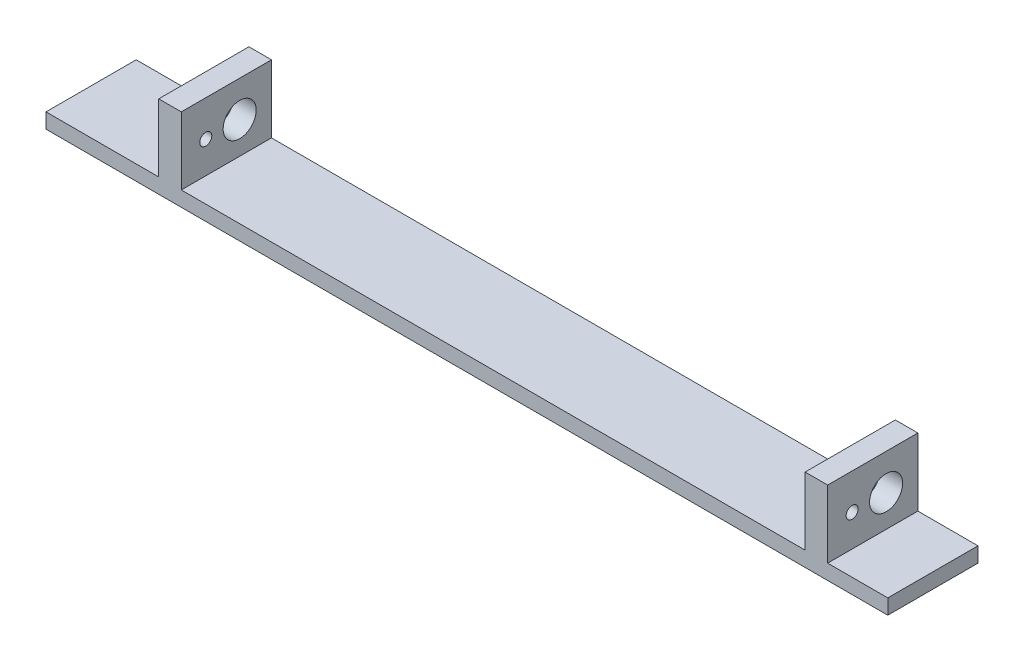
ISO-10303-21;
HEADER;
FILE_DESCRIPTION(('STEP AP214'),'2;1');
FILE_NAME('part.step','',(''),(''),'','','');
FILE_SCHEMA(('AUTOMOTIVE_DESIGN { 1 0 10303 214 1 1 1 1 }'));
ENDSEC;
DATA;
#1=APPLICATION_CONTEXT('core data for automotive mechanical design processes');
#2=APPLICATION_PROTOCOL_DEFINITION('international standard','automotive_design',2000,#1);
#3=PRODUCT_CONTEXT('',#1,'mechanical');
#4=PRODUCT('Part','Part','',(#3));
#5=PRODUCT_RELATED_PRODUCT_CATEGORY('part','',(#4));
#6=PRODUCT_DEFINITION_FORMATION('','',#4);
#7=PRODUCT_DEFINITION_CONTEXT('part definition',#1,'design');
#8=PRODUCT_DEFINITION('design','',#6,#7);
#9=PRODUCT_DEFINITION_SHAPE('','',#8);
#10=(LENGTH_UNIT() NAMED_UNIT(*) SI_UNIT(.MILLI.,.METRE.));
#11=(NAMED_UNIT(*) PLANE_ANGLE_UNIT() SI_UNIT($,.RADIAN.));
#12=(NAMED_UNIT(*) SI_UNIT($,.STERADIAN.) SOLID_ANGLE_UNIT());
#13=UNCERTAINTY_MEASURE_WITH_UNIT(LENGTH_MEASURE(1.E-05),#10,'distance_accuracy_value','');
#14=(GEOMETRIC_REPRESENTATION_CONTEXT(3) GLOBAL_UNCERTAINTY_ASSIGNED_CONTEXT((#13)) GLOBAL_UNIT_ASSIGNED_CONTEXT((#10,
#11,#12)) REPRESENTATION_CONTEXT('',''));
#15=CARTESIAN_POINT('',(0.,0.,0.));
#16=DIRECTION('',(0.,0.,1.));
#17=DIRECTION('',(1.,0.,0.));
#18=AXIS2_PLACEMENT_3D('',#15,#16,#17);
#19=CARTESIAN_POINT('',(560.,5.,30.));
#20=DIRECTION('',(0.,-1.,0.));
#21=DIRECTION('',(0.,0.,-1.));
#22=AXIS2_PLACEMENT_3D('',#19,#20,#21);
#23=PLANE('',#22);
#24=DIRECTION('',(0.,0.,1.));
#25=VECTOR('',#24,1.);
#26=CARTESIAN_POINT('',(505.,5.,30.));
#27=LINE('',#26,#25);
#28=CARTESIAN_POINT('',(505.,5.,-30.));
#29=VERTEX_POINT('',#28);
#30=CARTESIAN_POINT('',(505.,5.,30.));
#31=VERTEX_POINT('',#30);
#32=EDGE_CURVE('E229',#29,#31,#27,.T.);
#33=ORIENTED_EDGE('',*,*,#32,.F.);
#34=DIRECTION('',(-1.,0.,0.));
#35=VECTOR('',#34,1.);
#36=CARTESIAN_POINT('',(560.,5.,-30.));
#37=LINE('',#36,#35);
#38=CARTESIAN_POINT('',(90.,5.,-30.));
#39=VERTEX_POINT('',#38);
#40=EDGE_CURVE('E44',#29,#39,#37,.T.);
#41=ORIENTED_EDGE('',*,*,#40,.T.);
#42=DIRECTION('',(0.,0.,-1.));
#43=VECTOR('',#42,1.);
#44=CARTESIAN_POINT('',(90.,5.,-30.));
#45=LINE('',#44,#43);
#46=CARTESIAN_POINT('',(90.,5.,30.));
#47=VERTEX_POINT('',#46);
#48=EDGE_CURVE('E149',#47,#39,#45,.T.);
#49=ORIENTED_EDGE('',*,*,#48,.F.);
#50=DIRECTION('',(-1.,0.,0.));
#51=VECTOR('',#50,1.);
#52=CARTESIAN_POINT('',(560.,5.,30.));
#53=LINE('',#52,#51);
#54=EDGE_CURVE('E204',#31,#47,#53,.T.);
#55=ORIENTED_EDGE('',*,*,#54,.F.);
#56=EDGE_LOOP('',(#33,#41,#49,#55));
#57=FACE_BOUND('',#56,.T.);
#58=ADVANCED_FACE('F35',(#57),#23,.F.);
#59=DIRECTION('',(0.,0.,-1.));
#60=VECTOR('',#59,1.);
#61=CARTESIAN_POINT('',(520.,5.,-30.));
#62=LINE('',#61,#60);
#63=CARTESIAN_POINT('',(520.,5.,30.));
#64=VERTEX_POINT('',#63);
#65=CARTESIAN_POINT('',(520.,5.,-30.));
#66=VERTEX_POINT('',#65);
#67=EDGE_CURVE('E143',#64,#66,#62,.T.);
#68=ORIENTED_EDGE('',*,*,#67,.F.);
#69=CARTESIAN_POINT('',(560.,5.,30.));
#70=VERTEX_POINT('',#69);
#71=EDGE_CURVE('E202',#70,#64,#53,.T.);
#72=ORIENTED_EDGE('',*,*,#71,.F.);
#73=DIRECTION('',(0.,0.,1.));
#74=VECTOR('',#73,1.);
#75=CARTESIAN_POINT('',(560.,5.,30.));
#76=LINE('',#75,#74);
#77=CARTESIAN_POINT('',(560.,5.,-30.));
#78=VERTEX_POINT('',#77);
#79=EDGE_CURVE('E181',#78,#70,#76,.T.);
#80=ORIENTED_EDGE('',*,*,#79,.F.);
#81=EDGE_CURVE('E11',#78,#66,#37,.T.);
#82=ORIENTED_EDGE('',*,*,#81,.T.);
#83=EDGE_LOOP('',(#68,#72,#80,#82));
#84=FACE_BOUND('',#83,.T.);
#85=ADVANCED_FACE('F242',(#84),#23,.F.);
#86=DIRECTION('',(0.,0.,1.));
#87=VECTOR('',#86,1.);
#88=CARTESIAN_POINT('',(75.,5.,30.));
#89=LINE('',#88,#87);
#90=CARTESIAN_POINT('',(75.,5.,-30.));
#91=VERTEX_POINT('',#90);
#92=CARTESIAN_POINT('',(75.,5.,30.));
#93=VERTEX_POINT('',#92);
#94=EDGE_CURVE('E61',#91,#93,#89,.T.);
#95=ORIENTED_EDGE('',*,*,#94,.F.);
#96=CARTESIAN_POINT('',(0.,5.,-30.));
#97=VERTEX_POINT('',#96);
#98=EDGE_CURVE('E46',#91,#97,#37,.T.);
#99=ORIENTED_EDGE('',*,*,#98,.T.);
#100=DIRECTION('',(0.,0.,1.));
#101=VECTOR('',#100,1.);
#102=CARTESIAN_POINT('',(0.,5.,30.));
#103=LINE('',#102,#101);
#104=CARTESIAN_POINT('',(0.,5.,30.));
#105=VERTEX_POINT('',#104);
#106=EDGE_CURVE('E190',#97,#105,#103,.T.);
#107=ORIENTED_EDGE('',*,*,#106,.T.);
#108=EDGE_CURVE('E201',#93,#105,#53,.T.);
#109=ORIENTED_EDGE('',*,*,#108,.F.);
#110=EDGE_LOOP('',(#95,#99,#107,#109));
#111=FACE_BOUND('',#110,.T.);
#112=ADVANCED_FACE('F259',(#111),#23,.F.);
#113=CARTESIAN_POINT('',(560.,5.,-30.));
#114=DIRECTION('',(0.,0.,1.));
#115=DIRECTION('',(1.,0.,0.));
#116=AXIS2_PLACEMENT_3D('',#113,#114,#115);
#117=PLANE('',#116);
#118=DIRECTION('',(0.,1.,0.));
#119=VECTOR('',#118,1.);
#120=CARTESIAN_POINT('',(0.,5.,-30.));
#121=LINE('',#120,#119);
#122=CARTESIAN_POINT('',(0.,-5.,-30.));
#123=VERTEX_POINT('',#122);
#124=EDGE_CURVE('E177',#123,#97,#121,.T.);
#125=ORIENTED_EDGE('',*,*,#124,.T.);
#126=ORIENTED_EDGE('',*,*,#98,.F.);
#127=DIRECTION('',(0.,-1.,0.));
#128=VECTOR('',#127,1.);
#129=CARTESIAN_POINT('',(75.,50.,-30.));
#130=LINE('',#129,#128);
#131=CARTESIAN_POINT('',(75.,50.,-30.));
#132=VERTEX_POINT('',#131);
#133=EDGE_CURVE('E163',#132,#91,#130,.T.);
#134=ORIENTED_EDGE('',*,*,#133,.F.);
#135=DIRECTION('',(-1.,0.,0.));
#136=VECTOR('',#135,1.);
#137=CARTESIAN_POINT('',(75.,50.,-30.));
#138=LINE('',#137,#136);
#139=CARTESIAN_POINT('',(90.,50.,-30.));
#140=VERTEX_POINT('',#139);
#141=EDGE_CURVE('E162',#140,#132,#138,.T.);
#142=ORIENTED_EDGE('',*,*,#141,.F.);
#143=DIRECTION('',(0.,-1.,0.));
#144=VECTOR('',#143,1.);
#145=CARTESIAN_POINT('',(90.,50.,-30.));
#146=LINE('',#145,#144);
#147=EDGE_CURVE('E169',#140,#39,#146,.T.);
#148=ORIENTED_EDGE('',*,*,#147,.T.);
#149=ORIENTED_EDGE('',*,*,#40,.F.);
#150=DIRECTION('',(0.,-1.,0.));
#151=VECTOR('',#150,1.);
#152=CARTESIAN_POINT('',(505.,50.,-30.));
#153=LINE('',#152,#151);
#154=CARTESIAN_POINT('',(505.,50.,-30.));
#155=VERTEX_POINT('',#154);
#156=EDGE_CURVE('E130',#155,#29,#153,.T.);
#157=ORIENTED_EDGE('',*,*,#156,.F.);
#158=DIRECTION('',(-1.,0.,0.));
#159=VECTOR('',#158,1.);
#160=CARTESIAN_POINT('',(505.,50.,-30.));
#161=LINE('',#160,#159);
#162=CARTESIAN_POINT('',(520.,50.,-30.));
#163=VERTEX_POINT('',#162);
#164=EDGE_CURVE('E134',#163,#155,#161,.T.);
#165=ORIENTED_EDGE('',*,*,#164,.F.);
#166=DIRECTION('',(0.,-1.,0.));
#167=VECTOR('',#166,1.);
#168=CARTESIAN_POINT('',(520.,50.,-30.));
#169=LINE('',#168,#167);
#170=EDGE_CURVE('E233',#163,#66,#169,.T.);
#171=ORIENTED_EDGE('',*,*,#170,.T.);
#172=ORIENTED_EDGE('',*,*,#81,.F.);
#173=DIRECTION('',(0.,1.,0.));
#174=VECTOR('',#173,1.);
#175=CARTESIAN_POINT('',(560.,5.,-30.));
#176=LINE('',#175,#174);
#177=CARTESIAN_POINT('',(560.,-5.,-30.));
#178=VERTEX_POINT('',#177);
#179=EDGE_CURVE('E178',#178,#78,#176,.T.);
#180=ORIENTED_EDGE('',*,*,#179,.F.);
#181=DIRECTION('',(-1.,0.,0.));
#182=VECTOR('',#181,1.);
#183=CARTESIAN_POINT('',(560.,-5.,-30.));
#184=LINE('',#183,#182);
#185=EDGE_CURVE('E188',#178,#123,#184,.T.);
#186=ORIENTED_EDGE('',*,*,#185,.T.);
#187=EDGE_LOOP('',(#125,#126,#134,#142,#148,#149,#157,#165,#171,#172,#180,#186));
#188=FACE_BOUND('',#187,.T.);
#189=ADVANCED_FACE('F37',(#188),#117,.F.);
#190=CARTESIAN_POINT('',(560.,5.,30.));
#191=DIRECTION('',(0.,0.,-1.));
#192=DIRECTION('',(-1.,0.,0.));
#193=AXIS2_PLACEMENT_3D('',#190,#191,#192);
#194=PLANE('',#193);
#195=DIRECTION('',(0.,-1.,0.));
#196=VECTOR('',#195,1.);
#197=CARTESIAN_POINT('',(0.,5.,30.));
#198=LINE('',#197,#196);
#199=CARTESIAN_POINT('',(0.,-5.,30.));
#200=VERTEX_POINT('',#199);
#201=EDGE_CURVE('E193',#105,#200,#198,.T.);
#202=ORIENTED_EDGE('',*,*,#201,.T.);
#203=DIRECTION('',(-1.,0.,0.));
#204=VECTOR('',#203,1.);
#205=CARTESIAN_POINT('',(560.,-5.,30.));
#206=LINE('',#205,#204);
#207=CARTESIAN_POINT('',(560.,-5.,30.));
#208=VERTEX_POINT('',#207);
#209=EDGE_CURVE('E198',#208,#200,#206,.T.);
#210=ORIENTED_EDGE('',*,*,#209,.F.);
#211=DIRECTION('',(0.,-1.,0.));
#212=VECTOR('',#211,1.);
#213=CARTESIAN_POINT('',(560.,5.,30.));
#214=LINE('',#213,#212);
#215=EDGE_CURVE('E184',#70,#208,#214,.T.);
#216=ORIENTED_EDGE('',*,*,#215,.F.);
#217=ORIENTED_EDGE('',*,*,#71,.T.);
#218=DIRECTION('',(0.,-1.,0.));
#219=VECTOR('',#218,1.);
#220=CARTESIAN_POINT('',(520.,50.,30.));
#221=LINE('',#220,#219);
#222=CARTESIAN_POINT('',(520.,50.,30.));
#223=VERTEX_POINT('',#222);
#224=EDGE_CURVE('E151',#223,#64,#221,.T.);
#225=ORIENTED_EDGE('',*,*,#224,.F.);
#226=DIRECTION('',(1.,0.,0.));
#227=VECTOR('',#226,1.);
#228=CARTESIAN_POINT('',(520.,50.,30.));
#229=LINE('',#228,#227);
#230=CARTESIAN_POINT('',(505.,50.,30.));
#231=VERTEX_POINT('',#230);
#232=EDGE_CURVE('E133',#231,#223,#229,.T.);
#233=ORIENTED_EDGE('',*,*,#232,.F.);
#234=DIRECTION('',(0.,-1.,0.));
#235=VECTOR('',#234,1.);
#236=CARTESIAN_POINT('',(505.,50.,30.));
#237=LINE('',#236,#235);
#238=EDGE_CURVE('E53',#231,#31,#237,.T.);
#239=ORIENTED_EDGE('',*,*,#238,.T.);
#240=ORIENTED_EDGE('',*,*,#54,.T.);
#241=DIRECTION('',(0.,-1.,0.));
#242=VECTOR('',#241,1.);
#243=CARTESIAN_POINT('',(90.,50.,30.));
#244=LINE('',#243,#242);
#245=CARTESIAN_POINT('',(90.,50.,30.));
#246=VERTEX_POINT('',#245);
#247=EDGE_CURVE('E171',#246,#47,#244,.T.);
#248=ORIENTED_EDGE('',*,*,#247,.F.);
#249=DIRECTION('',(1.,0.,0.));
#250=VECTOR('',#249,1.);
#251=CARTESIAN_POINT('',(90.,50.,30.));
#252=LINE('',#251,#250);
#253=CARTESIAN_POINT('',(75.,50.,30.));
#254=VERTEX_POINT('',#253);
#255=EDGE_CURVE('E158',#254,#246,#252,.T.);
#256=ORIENTED_EDGE('',*,*,#255,.F.);
#257=DIRECTION('',(0.,-1.,0.));
#258=VECTOR('',#257,1.);
#259=CARTESIAN_POINT('',(75.,50.,30.));
#260=LINE('',#259,#258);
#261=EDGE_CURVE('E174',#254,#93,#260,.T.);
#262=ORIENTED_EDGE('',*,*,#261,.T.);
#263=ORIENTED_EDGE('',*,*,#108,.T.);
#264=EDGE_LOOP('',(#202,#210,#216,#217,#225,#233,#239,#240,#248,#256,#262,#263));
#265=FACE_BOUND('',#264,.T.);
#266=ADVANCED_FACE('F245',(#265),#194,.F.);
#267=CARTESIAN_POINT('',(560.,-5.,30.));
#268=DIRECTION('',(0.,1.,0.));
#269=DIRECTION('',(0.,0.,1.));
#270=AXIS2_PLACEMENT_3D('',#267,#268,#269);
#271=PLANE('',#270);
#272=DIRECTION('',(0.,0.,-1.));
#273=VECTOR('',#272,1.);
#274=CARTESIAN_POINT('',(0.,-5.,30.));
#275=LINE('',#274,#273);
#276=EDGE_CURVE('E182',#200,#123,#275,.T.);
#277=ORIENTED_EDGE('',*,*,#276,.T.);
#278=ORIENTED_EDGE('',*,*,#185,.F.);
#279=DIRECTION('',(0.,0.,-1.));
#280=VECTOR('',#279,1.);
#281=CARTESIAN_POINT('',(560.,-5.,30.));
#282=LINE('',#281,#280);
#283=EDGE_CURVE('E186',#208,#178,#282,.T.);
#284=ORIENTED_EDGE('',*,*,#283,.F.);
#285=ORIENTED_EDGE('',*,*,#209,.T.);
#286=EDGE_LOOP('',(#277,#278,#284,#285));
#287=FACE_BOUND('',#286,.T.);
#288=ADVANCED_FACE('F300',(#287),#271,.F.);
#289=CARTESIAN_POINT('',(560.,0.,0.));
#290=DIRECTION('',(1.,0.,0.));
#291=DIRECTION('',(0.,0.,-1.));
#292=AXIS2_PLACEMENT_3D('',#289,#290,#291);
#293=PLANE('',#292);
#294=ORIENTED_EDGE('',*,*,#179,.T.);
#295=ORIENTED_EDGE('',*,*,#79,.T.);
#296=ORIENTED_EDGE('',*,*,#215,.T.);
#297=ORIENTED_EDGE('',*,*,#283,.T.);
#298=EDGE_LOOP('',(#294,#295,#296,#297));
#299=FACE_BOUND('',#298,.T.);
#300=ADVANCED_FACE('F249',(#299),#293,.T.);
#301=CARTESIAN_POINT('',(0.,0.,0.));
#302=DIRECTION('',(1.,0.,0.));
#303=DIRECTION('',(0.,0.,-1.));
#304=AXIS2_PLACEMENT_3D('',#301,#302,#303);
#305=PLANE('',#304);
#306=ORIENTED_EDGE('',*,*,#124,.F.);
#307=ORIENTED_EDGE('',*,*,#276,.F.);
#308=ORIENTED_EDGE('',*,*,#201,.F.);
#309=ORIENTED_EDGE('',*,*,#106,.F.);
#310=EDGE_LOOP('',(#306,#307,#308,#309));
#311=FACE_BOUND('',#310,.T.);
#312=ADVANCED_FACE('F257',(#311),#305,.F.);
#313=CARTESIAN_POINT('',(75.,50.,30.));
#314=DIRECTION('',(1.,0.,0.));
#315=DIRECTION('',(0.,0.,-1.));
#316=AXIS2_PLACEMENT_3D('',#313,#314,#315);
#317=PLANE('',#316);
#318=CARTESIAN_POINT('',(75.,26.15,-8.85000000000001));
#319=DIRECTION('',(-1.,0.,0.));
#320=DIRECTION('',(0.,0.,1.));
#321=AXIS2_PLACEMENT_3D('',#318,#319,#320);
#322=CIRCLE('',#321,11.);
#323=CARTESIAN_POINT('',(75.,26.15,2.14999999999999));
#324=VERTEX_POINT('',#323);
#325=EDGE_CURVE('E208',#324,#324,#322,.T.);
#326=ORIENTED_EDGE('',*,*,#325,.F.);
#327=EDGE_LOOP('',(#326));
#328=FACE_BOUND('',#327,.T.);
#329=CARTESIAN_POINT('',(75.,26.15,13.717950956118));
#330=DIRECTION('',(-1.,0.,0.));
#331=DIRECTION('',(0.,0.,1.));
#332=AXIS2_PLACEMENT_3D('',#329,#330,#331);
#333=CIRCLE('',#332,4.);
#334=CARTESIAN_POINT('',(75.,26.15,17.717950956118));
#335=VERTEX_POINT('',#334);
#336=EDGE_CURVE('E215',#335,#335,#333,.T.);
#337=ORIENTED_EDGE('',*,*,#336,.F.);
#338=EDGE_LOOP('',(#337));
#339=FACE_BOUND('',#338,.T.);
#340=ORIENTED_EDGE('',*,*,#94,.T.);
#341=ORIENTED_EDGE('',*,*,#261,.F.);
#342=DIRECTION('',(0.,0.,1.));
#343=VECTOR('',#342,1.);
#344=CARTESIAN_POINT('',(75.,50.,30.));
#345=LINE('',#344,#343);
#346=EDGE_CURVE('E155',#132,#254,#345,.T.);
#347=ORIENTED_EDGE('',*,*,#346,.F.);
#348=ORIENTED_EDGE('',*,*,#133,.T.);
#349=EDGE_LOOP('',(#340,#341,#347,#348));
#350=FACE_BOUND('',#349,.T.);
#351=ADVANCED_FACE('F275',(#328,#339,#350),#317,.F.);
#352=CARTESIAN_POINT('',(90.,50.,-30.));
#353=DIRECTION('',(-1.,0.,0.));
#354=DIRECTION('',(0.,0.,1.));
#355=AXIS2_PLACEMENT_3D('',#352,#353,#354);
#356=PLANE('',#355);
#357=CARTESIAN_POINT('',(90.,26.15,-8.85000000000001));
#358=DIRECTION('',(-1.,0.,0.));
#359=DIRECTION('',(0.,0.,1.));
#360=AXIS2_PLACEMENT_3D('',#357,#358,#359);
#361=CIRCLE('',#360,11.);
#362=CARTESIAN_POINT('',(90.,26.15,2.14999999999999));
#363=VERTEX_POINT('',#362);
#364=EDGE_CURVE('E227',#363,#363,#361,.T.);
#365=ORIENTED_EDGE('',*,*,#364,.T.);
#366=EDGE_LOOP('',(#365));
#367=FACE_BOUND('',#366,.T.);
#368=CARTESIAN_POINT('',(90.,26.15,13.717950956118));
#369=DIRECTION('',(-1.,0.,0.));
#370=DIRECTION('',(0.,0.,1.));
#371=AXIS2_PLACEMENT_3D('',#368,#369,#370);
#372=CIRCLE('',#371,4.);
#373=CARTESIAN_POINT('',(90.,26.15,17.717950956118));
#374=VERTEX_POINT('',#373);
#375=EDGE_CURVE('E212',#374,#374,#372,.T.);
#376=ORIENTED_EDGE('',*,*,#375,.T.);
#377=EDGE_LOOP('',(#376));
#378=FACE_BOUND('',#377,.T.);
#379=ORIENTED_EDGE('',*,*,#48,.T.);
#380=ORIENTED_EDGE('',*,*,#147,.F.);
#381=DIRECTION('',(0.,0.,-1.));
#382=VECTOR('',#381,1.);
#383=CARTESIAN_POINT('',(90.,50.,-30.));
#384=LINE('',#383,#382);
#385=EDGE_CURVE('E160',#246,#140,#384,.T.);
#386=ORIENTED_EDGE('',*,*,#385,.F.);
#387=ORIENTED_EDGE('',*,*,#247,.T.);
#388=EDGE_LOOP('',(#379,#380,#386,#387));
#389=FACE_BOUND('',#388,.T.);
#390=ADVANCED_FACE('F266',(#367,#378,#389),#356,.F.);
#391=CARTESIAN_POINT('',(0.,50.,0.));
#392=DIRECTION('',(0.,-1.,0.));
#393=DIRECTION('',(0.,0.,-1.));
#394=AXIS2_PLACEMENT_3D('',#391,#392,#393);
#395=PLANE('',#394);
#396=ORIENTED_EDGE('',*,*,#346,.T.);
#397=ORIENTED_EDGE('',*,*,#255,.T.);
#398=ORIENTED_EDGE('',*,*,#385,.T.);
#399=ORIENTED_EDGE('',*,*,#141,.T.);
#400=EDGE_LOOP('',(#396,#397,#398,#399));
#401=FACE_BOUND('',#400,.T.);
#402=ADVANCED_FACE('F272',(#401),#395,.F.);
#403=CARTESIAN_POINT('',(505.,50.,30.));
#404=DIRECTION('',(1.,0.,0.));
#405=DIRECTION('',(0.,0.,-1.));
#406=AXIS2_PLACEMENT_3D('',#403,#404,#405);
#407=PLANE('',#406);
#408=CARTESIAN_POINT('',(505.,26.15,-8.85000000000001));
#409=DIRECTION('',(1.,0.,0.));
#410=DIRECTION('',(0.,0.,-1.));
#411=AXIS2_PLACEMENT_3D('',#408,#409,#410);
#412=CIRCLE('',#411,11.);
#413=CARTESIAN_POINT('',(505.,26.15,2.14999999999999));
#414=VERTEX_POINT('',#413);
#415=EDGE_CURVE('E224',#414,#414,#412,.T.);
#416=ORIENTED_EDGE('',*,*,#415,.T.);
#417=EDGE_LOOP('',(#416));
#418=FACE_BOUND('',#417,.T.);
#419=CARTESIAN_POINT('',(505.,26.15,13.717950956118));
#420=DIRECTION('',(1.,0.,0.));
#421=DIRECTION('',(0.,0.,-1.));
#422=AXIS2_PLACEMENT_3D('',#419,#420,#421);
#423=CIRCLE('',#422,4.);
#424=CARTESIAN_POINT('',(505.,26.15,17.717950956118));
#425=VERTEX_POINT('',#424);
#426=EDGE_CURVE('E207',#425,#425,#423,.T.);
#427=ORIENTED_EDGE('',*,*,#426,.T.);
#428=EDGE_LOOP('',(#427));
#429=FACE_BOUND('',#428,.T.);
#430=ORIENTED_EDGE('',*,*,#32,.T.);
#431=ORIENTED_EDGE('',*,*,#238,.F.);
#432=DIRECTION('',(0.,0.,1.));
#433=VECTOR('',#432,1.);
#434=CARTESIAN_POINT('',(505.,50.,30.));
#435=LINE('',#434,#433);
#436=EDGE_CURVE('E126',#155,#231,#435,.T.);
#437=ORIENTED_EDGE('',*,*,#436,.F.);
#438=ORIENTED_EDGE('',*,*,#156,.T.);
#439=EDGE_LOOP('',(#430,#431,#437,#438));
#440=FACE_BOUND('',#439,.T.);
#441=ADVANCED_FACE('F128',(#418,#429,#440),#407,.F.);
#442=CARTESIAN_POINT('',(520.,50.,-30.));
#443=DIRECTION('',(-1.,0.,0.));
#444=DIRECTION('',(0.,0.,1.));
#445=AXIS2_PLACEMENT_3D('',#442,#443,#444);
#446=PLANE('',#445);
#447=CARTESIAN_POINT('',(520.,26.15,-8.85000000000001));
#448=DIRECTION('',(-1.,0.,0.));
#449=DIRECTION('',(0.,0.,1.));
#450=AXIS2_PLACEMENT_3D('',#447,#448,#449);
#451=CIRCLE('',#450,11.);
#452=CARTESIAN_POINT('',(520.,26.15,2.14999999999999));
#453=VERTEX_POINT('',#452);
#454=EDGE_CURVE('E39',#453,#453,#451,.T.);
#455=ORIENTED_EDGE('',*,*,#454,.T.);
#456=EDGE_LOOP('',(#455));
#457=FACE_BOUND('',#456,.T.);
#458=CARTESIAN_POINT('',(520.,26.15,13.717950956118));
#459=DIRECTION('',(-1.,0.,0.));
#460=DIRECTION('',(0.,0.,1.));
#461=AXIS2_PLACEMENT_3D('',#458,#459,#460);
#462=CIRCLE('',#461,4.);
#463=CARTESIAN_POINT('',(520.,26.15,17.717950956118));
#464=VERTEX_POINT('',#463);
#465=EDGE_CURVE('E205',#464,#464,#462,.T.);
#466=ORIENTED_EDGE('',*,*,#465,.T.);
#467=EDGE_LOOP('',(#466));
#468=FACE_BOUND('',#467,.T.);
#469=ORIENTED_EDGE('',*,*,#67,.T.);
#470=ORIENTED_EDGE('',*,*,#170,.F.);
#471=DIRECTION('',(0.,0.,-1.));
#472=VECTOR('',#471,1.);
#473=CARTESIAN_POINT('',(520.,50.,-30.));
#474=LINE('',#473,#472);
#475=EDGE_CURVE('E139',#223,#163,#474,.T.);
#476=ORIENTED_EDGE('',*,*,#475,.F.);
#477=ORIENTED_EDGE('',*,*,#224,.T.);
#478=EDGE_LOOP('',(#469,#470,#476,#477));
#479=FACE_BOUND('',#478,.T.);
#480=ADVANCED_FACE('F239',(#457,#468,#479),#446,.F.);
#481=CARTESIAN_POINT('',(0.,50.,0.));
#482=DIRECTION('',(0.,-1.,0.));
#483=DIRECTION('',(0.,0.,-1.));
#484=AXIS2_PLACEMENT_3D('',#481,#482,#483);
#485=PLANE('',#484);
#486=ORIENTED_EDGE('',*,*,#164,.T.);
#487=ORIENTED_EDGE('',*,*,#436,.T.);
#488=ORIENTED_EDGE('',*,*,#232,.T.);
#489=ORIENTED_EDGE('',*,*,#475,.T.);
#490=EDGE_LOOP('',(#486,#487,#488,#489));
#491=FACE_BOUND('',#490,.T.);
#492=ADVANCED_FACE('F137',(#491),#485,.F.);
#493=CARTESIAN_POINT('',(530.,26.15,13.717950956118));
#494=DIRECTION('',(-1.,0.,0.));
#495=DIRECTION('',(0.,0.,1.));
#496=AXIS2_PLACEMENT_3D('',#493,#494,#495);
#497=CYLINDRICAL_SURFACE('',#496,4.);
#498=CARTESIAN_POINT('',(520.,26.15,17.717950956118));
#499=CARTESIAN_POINT('',(519.84375,26.15,17.717950956118));
#500=CARTESIAN_POINT('',(519.6875,26.15,17.717950956118));
#501=CARTESIAN_POINT('',(519.375,26.15,17.717950956118));
#502=CARTESIAN_POINT('',(519.21875,26.15,17.717950956118));
#503=CARTESIAN_POINT('',(518.90625,26.15,17.717950956118));
#504=CARTESIAN_POINT('',(518.75,26.15,17.717950956118));
#505=CARTESIAN_POINT('',(518.4375,26.15,17.717950956118));
#506=CARTESIAN_POINT('',(518.28125,26.15,17.717950956118));
#507=CARTESIAN_POINT('',(517.96875,26.15,17.717950956118));
#508=CARTESIAN_POINT('',(517.8125,26.15,17.717950956118));
#509=CARTESIAN_POINT('',(517.5,26.15,17.717950956118));
#510=CARTESIAN_POINT('',(517.34375,26.15,17.717950956118));
#511=CARTESIAN_POINT('',(517.03125,26.15,17.717950956118));
#512=CARTESIAN_POINT('',(516.875,26.15,17.717950956118));
#513=CARTESIAN_POINT('',(516.5625,26.15,17.717950956118));
#514=CARTESIAN_POINT('',(516.40625,26.15,17.717950956118));
#515=CARTESIAN_POINT('',(516.09375,26.15,17.717950956118));
#516=CARTESIAN_POINT('',(515.9375,26.15,17.717950956118));
#517=CARTESIAN_POINT('',(515.625,26.15,17.717950956118));
#518=CARTESIAN_POINT('',(515.46875,26.15,17.717950956118));
#519=CARTESIAN_POINT('',(515.15625,26.15,17.717950956118));
#520=CARTESIAN_POINT('',(515.,26.15,17.717950956118));
#521=CARTESIAN_POINT('',(514.6875,26.15,17.717950956118));
#522=CARTESIAN_POINT('',(514.53125,26.15,17.717950956118));
#523=CARTESIAN_POINT('',(514.21875,26.15,17.717950956118));
#524=CARTESIAN_POINT('',(514.0625,26.15,17.717950956118));
#525=CARTESIAN_POINT('',(513.75,26.15,17.717950956118));
#526=CARTESIAN_POINT('',(513.59375,26.15,17.717950956118));
#527=CARTESIAN_POINT('',(513.28125,26.15,17.717950956118));
#528=CARTESIAN_POINT('',(513.125,26.15,17.717950956118));
#529=CARTESIAN_POINT('',(512.8125,26.15,17.717950956118));
#530=CARTESIAN_POINT('',(512.65625,26.15,17.717950956118));
#531=CARTESIAN_POINT('',(512.34375,26.15,17.717950956118));
#532=CARTESIAN_POINT('',(512.1875,26.15,17.717950956118));
#533=CARTESIAN_POINT('',(511.875,26.15,17.717950956118));
#534=CARTESIAN_POINT('',(511.71875,26.15,17.717950956118));
#535=CARTESIAN_POINT('',(511.40625,26.15,17.717950956118));
#536=CARTESIAN_POINT('',(511.25,26.15,17.717950956118));
#537=CARTESIAN_POINT('',(510.9375,26.15,17.717950956118));
#538=CARTESIAN_POINT('',(510.78125,26.15,17.717950956118));
#539=CARTESIAN_POINT('',(510.46875,26.15,17.717950956118));
#540=CARTESIAN_POINT('',(510.3125,26.15,17.717950956118));
#541=CARTESIAN_POINT('',(510.,26.15,17.717950956118));
#542=CARTESIAN_POINT('',(509.84375,26.15,17.717950956118));
#543=CARTESIAN_POINT('',(509.53125,26.15,17.717950956118));
#544=CARTESIAN_POINT('',(509.375,26.15,17.717950956118));
#545=CARTESIAN_POINT('',(509.0625,26.15,17.717950956118));
#546=CARTESIAN_POINT('',(508.90625,26.15,17.717950956118));
#547=CARTESIAN_POINT('',(508.59375,26.15,17.717950956118));
#548=CARTESIAN_POINT('',(508.4375,26.15,17.717950956118));
#549=CARTESIAN_POINT('',(508.125,26.15,17.717950956118));
#550=CARTESIAN_POINT('',(507.96875,26.15,17.717950956118));
#551=CARTESIAN_POINT('',(507.65625,26.15,17.717950956118));
#552=CARTESIAN_POINT('',(507.5,26.15,17.717950956118));
#553=CARTESIAN_POINT('',(507.1875,26.15,17.717950956118));
#554=CARTESIAN_POINT('',(507.03125,26.15,17.717950956118));
#555=CARTESIAN_POINT('',(506.71875,26.15,17.717950956118));
#556=CARTESIAN_POINT('',(506.5625,26.15,17.717950956118));
#557=CARTESIAN_POINT('',(506.25,26.15,17.717950956118));
#558=CARTESIAN_POINT('',(506.09375,26.15,17.717950956118));
#559=CARTESIAN_POINT('',(505.78125,26.15,17.717950956118));
#560=CARTESIAN_POINT('',(505.625,26.15,17.717950956118));
#561=CARTESIAN_POINT('',(505.3125,26.15,17.717950956118));
#562=CARTESIAN_POINT('',(505.15625,26.15,17.717950956118));
#563=CARTESIAN_POINT('',(505.,26.15,17.717950956118));
#564=B_SPLINE_CURVE_WITH_KNOTS('',3,(#498,#499,#500,#501,#502,#503,#504,#505,#506,#507,#508,
#509,#510,#511,#512,#513,#514,#515,#516,#517,#518,#519,#520,#521,#522,#523,#524,#525,#526,#527,
#528,#529,#530,#531,#532,#533,#534,#535,#536,#537,#538,#539,#540,#541,#542,#543,#544,#545,#546,
#547,#548,#549,#550,#551,#552,#553,#554,#555,#556,#557,#558,#559,#560,#561,#562,#563),
.UNSPECIFIED.,.F.,.F.,(4,2,2,2,2,2,2,2,2,2,2,2,2,2,2,2,2,2,2,2,2,2,2,2,2,2,2,2,2,2,2,2,4),(0.,
0.468749999999907,0.937499999999925,1.40624999999994,1.87499999999996,2.34374999999998,2.8125,
3.28125000000001,3.74999999999992,4.21874999999994,4.68749999999996,5.15624999999997,
5.62499999999999,6.09375000000001,6.56250000000003,7.03125000000004,7.50000000000006,
7.96874999999997,8.43749999999999,8.90625,9.37500000000002,9.84375000000004,10.3125000000001,
10.7812500000001,11.25,11.71875,12.1875,12.65625,13.1250000000001,13.5937500000001,
14.0625000000001,14.5312500000001,15.0000000000001),.UNSPECIFIED.);
#565=EDGE_CURVE('BSEAM362',#464,#425,#564,.T.);
#566=ORIENTED_EDGE('',*,*,#465,.F.);
#567=ORIENTED_EDGE('',*,*,#426,.F.);
#568=ORIENTED_EDGE('',*,*,#565,.T.);
#569=ORIENTED_EDGE('',*,*,#565,.F.);
#570=EDGE_LOOP('',(#566,#568,#567,#569));
#571=FACE_BOUND('',#570,.T.);
#572=ADVANCED_FACE('F362',(#571),#497,.F.);
#573=CARTESIAN_POINT('',(530.,26.15,-8.85000000000001));
#574=DIRECTION('',(-1.,0.,0.));
#575=DIRECTION('',(0.,0.,1.));
#576=AXIS2_PLACEMENT_3D('',#573,#574,#575);
#577=CYLINDRICAL_SURFACE('',#576,11.);
#578=CARTESIAN_POINT('',(520.,26.15,2.14999999999999));
#579=CARTESIAN_POINT('',(519.84375,26.15,2.14999999999999));
#580=CARTESIAN_POINT('',(519.6875,26.15,2.14999999999999));
#581=CARTESIAN_POINT('',(519.375,26.15,2.14999999999999));
#582=CARTESIAN_POINT('',(519.21875,26.15,2.14999999999999));
#583=CARTESIAN_POINT('',(518.90625,26.15,2.14999999999999));
#584=CARTESIAN_POINT('',(518.75,26.15,2.14999999999999));
#585=CARTESIAN_POINT('',(518.4375,26.15,2.14999999999999));
#586=CARTESIAN_POINT('',(518.28125,26.15,2.14999999999999));
#587=CARTESIAN_POINT('',(517.96875,26.15,2.14999999999999));
#588=CARTESIAN_POINT('',(517.8125,26.15,2.14999999999999));
#589=CARTESIAN_POINT('',(517.5,26.15,2.14999999999999));
#590=CARTESIAN_POINT('',(517.34375,26.15,2.14999999999999));
#591=CARTESIAN_POINT('',(517.03125,26.15,2.14999999999999));
#592=CARTESIAN_POINT('',(516.875,26.15,2.14999999999999));
#593=CARTESIAN_POINT('',(516.5625,26.15,2.14999999999999));
#594=CARTESIAN_POINT('',(516.40625,26.15,2.14999999999999));
#595=CARTESIAN_POINT('',(516.09375,26.15,2.14999999999999));
#596=CARTESIAN_POINT('',(515.9375,26.15,2.14999999999999));
#597=CARTESIAN_POINT('',(515.625,26.15,2.14999999999999));
#598=CARTESIAN_POINT('',(515.46875,26.15,2.14999999999999));
#599=CARTESIAN_POINT('',(515.15625,26.15,2.14999999999999));
#600=CARTESIAN_POINT('',(515.,26.15,2.14999999999999));
#601=CARTESIAN_POINT('',(514.6875,26.15,2.14999999999999));
#602=CARTESIAN_POINT('',(514.53125,26.15,2.14999999999999));
#603=CARTESIAN_POINT('',(514.21875,26.15,2.14999999999999));
#604=CARTESIAN_POINT('',(514.0625,26.15,2.14999999999999));
#605=CARTESIAN_POINT('',(513.75,26.15,2.14999999999999));
#606=CARTESIAN_POINT('',(513.59375,26.15,2.14999999999999));
#607=CARTESIAN_POINT('',(513.28125,26.15,2.14999999999999));
#608=CARTESIAN_POINT('',(513.125,26.15,2.14999999999999));
#609=CARTESIAN_POINT('',(512.8125,26.15,2.14999999999999));
#610=CARTESIAN_POINT('',(512.65625,26.15,2.14999999999999));
#611=CARTESIAN_POINT('',(512.34375,26.15,2.14999999999999));
#612=CARTESIAN_POINT('',(512.1875,26.15,2.14999999999999));
#613=CARTESIAN_POINT('',(511.875,26.15,2.14999999999999));
#614=CARTESIAN_POINT('',(511.71875,26.15,2.14999999999999));
#615=CARTESIAN_POINT('',(511.40625,26.15,2.14999999999999));
#616=CARTESIAN_POINT('',(511.25,26.15,2.14999999999999));
#617=CARTESIAN_POINT('',(510.9375,26.15,2.14999999999999));
#618=CARTESIAN_POINT('',(510.78125,26.15,2.14999999999999));
#619=CARTESIAN_POINT('',(510.46875,26.15,2.14999999999999));
#620=CARTESIAN_POINT('',(510.3125,26.15,2.14999999999999));
#621=CARTESIAN_POINT('',(510.,26.15,2.14999999999999));
#622=CARTESIAN_POINT('',(509.84375,26.15,2.14999999999999));
#623=CARTESIAN_POINT('',(509.53125,26.15,2.14999999999999));
#624=CARTESIAN_POINT('',(509.375,26.15,2.14999999999999));
#625=CARTESIAN_POINT('',(509.0625,26.15,2.14999999999999));
#626=CARTESIAN_POINT('',(508.90625,26.15,2.14999999999999));
#627=CARTESIAN_POINT('',(508.59375,26.15,2.14999999999999));
#628=CARTESIAN_POINT('',(508.4375,26.15,2.14999999999999));
#629=CARTESIAN_POINT('',(508.125,26.15,2.14999999999999));
#630=CARTESIAN_POINT('',(507.96875,26.15,2.14999999999999));
#631=CARTESIAN_POINT('',(507.65625,26.15,2.14999999999999));
#632=CARTESIAN_POINT('',(507.5,26.15,2.14999999999999));
#633=CARTESIAN_POINT('',(507.1875,26.15,2.14999999999999));
#634=CARTESIAN_POINT('',(507.03125,26.15,2.14999999999999));
#635=CARTESIAN_POINT('',(506.71875,26.15,2.14999999999999));
#636=CARTESIAN_POINT('',(506.5625,26.15,2.14999999999999));
#637=CARTESIAN_POINT('',(506.25,26.15,2.14999999999999));
#638=CARTESIAN_POINT('',(506.09375,26.15,2.14999999999999));
#639=CARTESIAN_POINT('',(505.78125,26.15,2.14999999999999));
#640=CARTESIAN_POINT('',(505.625,26.15,2.14999999999999));
#641=CARTESIAN_POINT('',(505.3125,26.15,2.14999999999999));
#642=CARTESIAN_POINT('',(505.15625,26.15,2.14999999999999));
#643=CARTESIAN_POINT('',(505.,26.15,2.14999999999999));
#644=B_SPLINE_CURVE_WITH_KNOTS('',3,(#578,#579,#580,#581,#582,#583,#584,#585,#586,#587,#588,
#589,#590,#591,#592,#593,#594,#595,#596,#597,#598,#599,#600,#601,#602,#603,#604,#605,#606,#607,
#608,#609,#610,#611,#612,#613,#614,#615,#616,#617,#618,#619,#620,#621,#622,#623,#624,#625,#626,
#627,#628,#629,#630,#631,#632,#633,#634,#635,#636,#637,#638,#639,#640,#641,#642,#643),
.UNSPECIFIED.,.F.,.F.,(4,2,2,2,2,2,2,2,2,2,2,2,2,2,2,2,2,2,2,2,2,2,2,2,2,2,2,2,2,2,2,2,4),(0.,
0.468749999999907,0.937499999999925,1.40624999999994,1.87499999999996,2.34374999999998,2.8125,
3.28125000000001,3.74999999999992,4.21874999999994,4.68749999999996,5.15624999999997,
5.62499999999999,6.09375000000001,6.56250000000003,7.03125000000004,7.50000000000006,
7.96874999999997,8.43749999999999,8.90625,9.37500000000002,9.84375000000004,10.3125000000001,
10.7812500000001,11.25,11.71875,12.1875,12.65625,13.1250000000001,13.5937500000001,
14.0625000000001,14.5312500000001,15.0000000000001),.UNSPECIFIED.);
#645=EDGE_CURVE('BSEAM397',#453,#414,#644,.T.);
#646=ORIENTED_EDGE('',*,*,#454,.F.);
#647=ORIENTED_EDGE('',*,*,#415,.F.);
#648=ORIENTED_EDGE('',*,*,#645,.T.);
#649=ORIENTED_EDGE('',*,*,#645,.F.);
#650=EDGE_LOOP('',(#646,#648,#647,#649));
#651=FACE_BOUND('',#650,.T.);
#652=ADVANCED_FACE('F397',(#651),#577,.F.);
#653=ORIENTED_EDGE('',*,*,#336,.T.);
#654=EDGE_LOOP('',(#653));
#655=FACE_BOUND('',#654,.T.);
#656=ORIENTED_EDGE('',*,*,#375,.F.);
#657=EDGE_LOOP('',(#656));
#658=FACE_BOUND('',#657,.T.);
#659=ADVANCED_FACE('F400',(#655,#658),#497,.F.);
#660=ORIENTED_EDGE('',*,*,#325,.T.);
#661=EDGE_LOOP('',(#660));
#662=FACE_BOUND('',#661,.T.);
#663=ORIENTED_EDGE('',*,*,#364,.F.);
#664=EDGE_LOOP('',(#663));
#665=FACE_BOUND('',#664,.T.);
#666=ADVANCED_FACE('F410',(#662,#665),#577,.F.);
#667=CLOSED_SHELL('',(#58,#85,#112,#189,#266,#288,#300,#312,#351,#390,#402,#441,#480,#492,#572,
#652,#659,#666));
#668=MANIFOLD_SOLID_BREP('B2',#667);
#669=ADVANCED_BREP_SHAPE_REPRESENTATION('',(#18,#668),#14);
#670=SHAPE_DEFINITION_REPRESENTATION(#9,#669);
ENDSEC;
END-ISO-10303-21;
